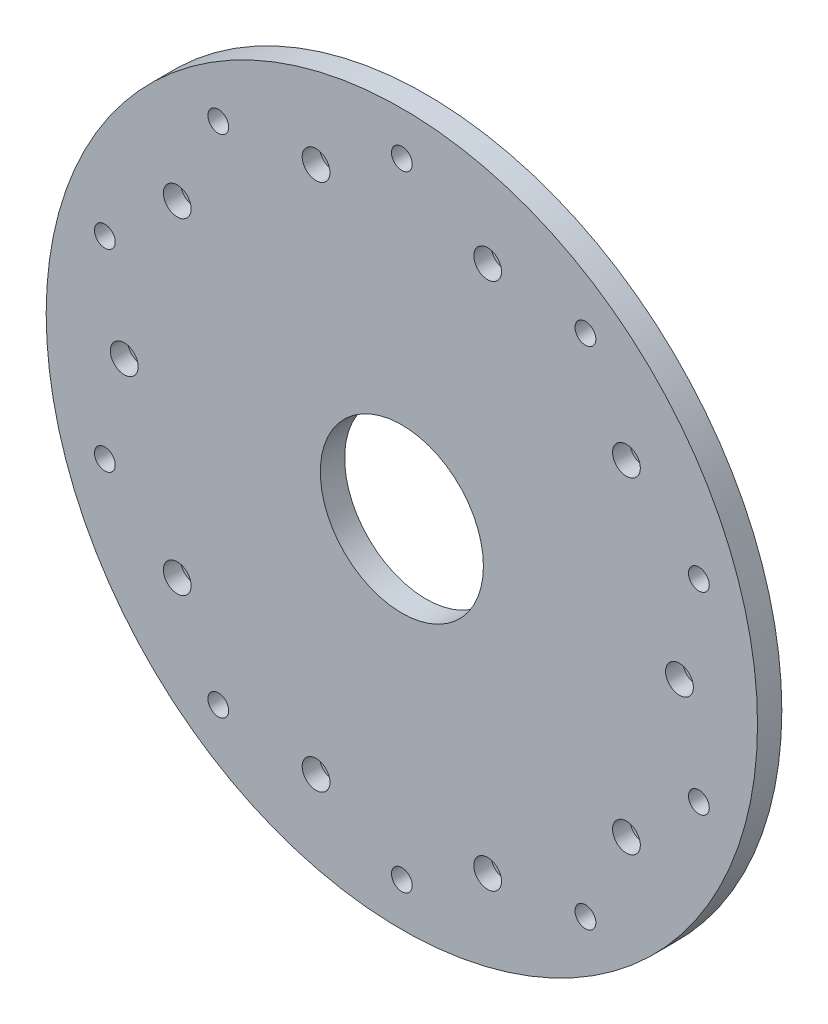
ISO-10303-21;
HEADER;
FILE_DESCRIPTION(('STEP AP214'),'2;1');
FILE_NAME('part.step','',(''),(''),'','','');
FILE_SCHEMA(('AUTOMOTIVE_DESIGN { 1 0 10303 214 1 1 1 1 }'));
ENDSEC;
DATA;
#1=APPLICATION_CONTEXT('core data for automotive mechanical design processes');
#2=APPLICATION_PROTOCOL_DEFINITION('international standard','automotive_design',2000,#1);
#3=PRODUCT_CONTEXT('',#1,'mechanical');
#4=PRODUCT('Part','Part','',(#3));
#5=PRODUCT_RELATED_PRODUCT_CATEGORY('part','',(#4));
#6=PRODUCT_DEFINITION_FORMATION('','',#4);
#7=PRODUCT_DEFINITION_CONTEXT('part definition',#1,'design');
#8=PRODUCT_DEFINITION('design','',#6,#7);
#9=PRODUCT_DEFINITION_SHAPE('','',#8);
#10=(LENGTH_UNIT() NAMED_UNIT(*) SI_UNIT(.MILLI.,.METRE.));
#11=(NAMED_UNIT(*) PLANE_ANGLE_UNIT() SI_UNIT($,.RADIAN.));
#12=(NAMED_UNIT(*) SI_UNIT($,.STERADIAN.) SOLID_ANGLE_UNIT());
#13=UNCERTAINTY_MEASURE_WITH_UNIT(LENGTH_MEASURE(1.E-05),#10,'distance_accuracy_value','');
#14=(GEOMETRIC_REPRESENTATION_CONTEXT(3) GLOBAL_UNCERTAINTY_ASSIGNED_CONTEXT((#13)) GLOBAL_UNIT_ASSIGNED_CONTEXT((#10,
#11,#12)) REPRESENTATION_CONTEXT('',''));
#15=CARTESIAN_POINT('',(0.,0.,0.));
#16=DIRECTION('',(0.,0.,1.));
#17=DIRECTION('',(1.,0.,0.));
#18=AXIS2_PLACEMENT_3D('',#15,#16,#17);
#19=CARTESIAN_POINT('',(0.,0.,7.));
#20=DIRECTION('',(0.,0.,1.));
#21=DIRECTION('',(1.,0.,0.));
#22=AXIS2_PLACEMENT_3D('',#19,#20,#21);
#23=PLANE('',#22);
#24=CARTESIAN_POINT('',(-24.7213595499959,76.0845213036123,7.));
#25=DIRECTION('',(0.,0.,1.));
#26=DIRECTION('',(0.809016994374947,0.587785252292474,0.));
#27=AXIS2_PLACEMENT_3D('',#24,#25,#26);
#28=CIRCLE('',#27,4.);
#29=CARTESIAN_POINT('',(-21.4852915724961,78.4356623127822,7.));
#30=VERTEX_POINT('',#29);
#31=EDGE_CURVE('E164',#30,#30,#28,.T.);
#32=ORIENTED_EDGE('',*,*,#31,.F.);
#33=EDGE_LOOP('',(#32));
#34=FACE_BOUND('',#33,.T.);
#35=CARTESIAN_POINT('',(-64.7213595499959,47.0228201833977,7.));
#36=DIRECTION('',(0.,0.,1.));
#37=DIRECTION('',(0.309016994374945,0.951056516295155,0.));
#38=AXIS2_PLACEMENT_3D('',#35,#36,#37);
#39=CIRCLE('',#38,4.);
#40=CARTESIAN_POINT('',(-63.4852915724961,50.8270462485783,7.));
#41=VERTEX_POINT('',#40);
#42=EDGE_CURVE('E158',#41,#41,#39,.T.);
#43=ORIENTED_EDGE('',*,*,#42,.F.);
#44=EDGE_LOOP('',(#43));
#45=FACE_BOUND('',#44,.T.);
#46=CARTESIAN_POINT('',(-80.,-2.8796409701215E-13,7.));
#47=DIRECTION('',(0.,0.,1.));
#48=DIRECTION('',(-0.309016994374952,0.951056516295152,0.));
#49=AXIS2_PLACEMENT_3D('',#46,#47,#48);
#50=CIRCLE('',#49,4.);
#51=CARTESIAN_POINT('',(-81.2360679774998,3.80422606518032,7.));
#52=VERTEX_POINT('',#51);
#53=EDGE_CURVE('E152',#52,#52,#50,.T.);
#54=ORIENTED_EDGE('',*,*,#53,.F.);
#55=EDGE_LOOP('',(#54));
#56=FACE_BOUND('',#55,.T.);
#57=CARTESIAN_POINT('',(-64.7213595499956,-47.0228201833982,7.));
#58=DIRECTION('',(0.,0.,1.));
#59=DIRECTION('',(-0.809016994374951,0.587785252292469,0.));
#60=AXIS2_PLACEMENT_3D('',#57,#58,#59);
#61=CIRCLE('',#60,4.);
#62=CARTESIAN_POINT('',(-67.9574275274954,-44.6716791742283,7.));
#63=VERTEX_POINT('',#62);
#64=EDGE_CURVE('E146',#63,#63,#61,.T.);
#65=ORIENTED_EDGE('',*,*,#64,.F.);
#66=EDGE_LOOP('',(#65));
#67=FACE_BOUND('',#66,.T.);
#68=CARTESIAN_POINT('',(-24.7213595499959,-76.0845213036123,7.));
#69=DIRECTION('',(0.,0.,1.));
#70=DIRECTION('',(-1.,0.,0.));
#71=AXIS2_PLACEMENT_3D('',#68,#69,#70);
#72=CIRCLE('',#71,4.);
#73=CARTESIAN_POINT('',(-28.7213595499959,-76.0845213036123,7.));
#74=VERTEX_POINT('',#73);
#75=EDGE_CURVE('E140',#74,#74,#72,.T.);
#76=ORIENTED_EDGE('',*,*,#75,.F.);
#77=EDGE_LOOP('',(#76));
#78=FACE_BOUND('',#77,.T.);
#79=CARTESIAN_POINT('',(24.7213595499964,-76.0845213036121,7.));
#80=DIRECTION('',(0.,0.,1.));
#81=DIRECTION('',(-0.809016994374942,-0.58778525229248,0.));
#82=AXIS2_PLACEMENT_3D('',#79,#80,#81);
#83=CIRCLE('',#82,4.);
#84=CARTESIAN_POINT('',(21.4852915724966,-78.435662312782,7.));
#85=VERTEX_POINT('',#84);
#86=EDGE_CURVE('E134',#85,#85,#83,.T.);
#87=ORIENTED_EDGE('',*,*,#86,.F.);
#88=EDGE_LOOP('',(#87));
#89=FACE_BOUND('',#88,.T.);
#90=CARTESIAN_POINT('',(64.7213595499962,-47.0228201833973,7.));
#91=DIRECTION('',(0.,0.,1.));
#92=DIRECTION('',(-0.309016994374938,-0.951056516295157,0.));
#93=AXIS2_PLACEMENT_3D('',#90,#91,#92);
#94=CIRCLE('',#93,4.);
#95=CARTESIAN_POINT('',(63.4852915724965,-50.8270462485779,7.));
#96=VERTEX_POINT('',#95);
#97=EDGE_CURVE('E128',#96,#96,#94,.T.);
#98=ORIENTED_EDGE('',*,*,#97,.F.);
#99=EDGE_LOOP('',(#98));
#100=FACE_BOUND('',#99,.T.);
#101=CARTESIAN_POINT('',(80.,8.50014503228635E-13,7.));
#102=DIRECTION('',(0.,0.,1.));
#103=DIRECTION('',(0.309016994374958,-0.95105651629515,0.));
#104=AXIS2_PLACEMENT_3D('',#101,#102,#103);
#105=CIRCLE('',#104,4.);
#106=CARTESIAN_POINT('',(81.2360679774998,-3.80422606517975,7.));
#107=VERTEX_POINT('',#106);
#108=EDGE_CURVE('E122',#107,#107,#105,.T.);
#109=ORIENTED_EDGE('',*,*,#108,.F.);
#110=EDGE_LOOP('',(#109));
#111=FACE_BOUND('',#110,.T.);
#112=CARTESIAN_POINT('',(64.7213595499952,47.0228201833987,7.));
#113=DIRECTION('',(0.,0.,1.));
#114=DIRECTION('',(0.809016994374955,-0.587785252292462,0.));
#115=AXIS2_PLACEMENT_3D('',#112,#113,#114);
#116=CIRCLE('',#115,4.);
#117=CARTESIAN_POINT('',(67.957427527495,44.6716791742288,7.));
#118=VERTEX_POINT('',#117);
#119=EDGE_CURVE('E116',#118,#118,#116,.T.);
#120=ORIENTED_EDGE('',*,*,#119,.F.);
#121=EDGE_LOOP('',(#120));
#122=FACE_BOUND('',#121,.T.);
#123=CARTESIAN_POINT('',(24.7213595499959,76.0845213036123,7.));
#124=DIRECTION('',(0.,0.,1.));
#125=DIRECTION('',(1.,0.,0.));
#126=AXIS2_PLACEMENT_3D('',#123,#124,#125);
#127=CIRCLE('',#126,4.);
#128=CARTESIAN_POINT('',(28.7213595499959,76.0845213036123,7.));
#129=VERTEX_POINT('',#128);
#130=EDGE_CURVE('E110',#129,#129,#127,.T.);
#131=ORIENTED_EDGE('',*,*,#130,.F.);
#132=EDGE_LOOP('',(#131));
#133=FACE_BOUND('',#132,.T.);
#134=CARTESIAN_POINT('',(0.,90.,7.));
#135=DIRECTION('',(0.,0.,1.));
#136=DIRECTION('',(1.,0.,0.));
#137=AXIS2_PLACEMENT_3D('',#134,#135,#136);
#138=CIRCLE('',#137,3.);
#139=CARTESIAN_POINT('',(3.,90.,7.));
#140=VERTEX_POINT('',#139);
#141=EDGE_CURVE('E99',#140,#140,#138,.T.);
#142=ORIENTED_EDGE('',*,*,#141,.F.);
#143=EDGE_LOOP('',(#142));
#144=FACE_BOUND('',#143,.T.);
#145=CARTESIAN_POINT('',(-52.9006727063221,72.8115294937437,7.));
#146=DIRECTION('',(0.,0.,1.));
#147=DIRECTION('',(1.,0.,0.));
#148=AXIS2_PLACEMENT_3D('',#145,#146,#147);
#149=CIRCLE('',#148,3.00000000000206);
#150=CARTESIAN_POINT('',(-49.9006727063201,72.8115294937437,7.));
#151=VERTEX_POINT('',#150);
#152=EDGE_CURVE('E100',#151,#151,#149,.T.);
#153=ORIENTED_EDGE('',*,*,#152,.F.);
#154=EDGE_LOOP('',(#153));
#155=FACE_BOUND('',#154,.T.);
#156=CARTESIAN_POINT('',(-85.5950864665621,27.8115294937428,7.));
#157=DIRECTION('',(0.,0.,1.));
#158=DIRECTION('',(1.,0.,0.));
#159=AXIS2_PLACEMENT_3D('',#156,#157,#158);
#160=CIRCLE('',#159,3.00000000000338);
#161=CARTESIAN_POINT('',(-82.5950864665587,27.8115294937428,7.));
#162=VERTEX_POINT('',#161);
#163=EDGE_CURVE('E50',#162,#162,#160,.T.);
#164=ORIENTED_EDGE('',*,*,#163,.F.);
#165=EDGE_LOOP('',(#164));
#166=FACE_BOUND('',#165,.T.);
#167=CARTESIAN_POINT('',(-85.5950864665605,-27.8115294937477,7.));
#168=DIRECTION('',(0.,0.,1.));
#169=DIRECTION('',(1.,0.,0.));
#170=AXIS2_PLACEMENT_3D('',#167,#168,#169);
#171=CIRCLE('',#170,3.00000000000472);
#172=CARTESIAN_POINT('',(-82.5950864665558,-27.8115294937477,7.));
#173=VERTEX_POINT('',#172);
#174=EDGE_CURVE('E57',#173,#173,#171,.T.);
#175=ORIENTED_EDGE('',*,*,#174,.F.);
#176=EDGE_LOOP('',(#175));
#177=FACE_BOUND('',#176,.T.);
#178=CARTESIAN_POINT('',(-52.900672706318,-72.8115294937468,7.));
#179=DIRECTION('',(0.,0.,1.));
#180=DIRECTION('',(1.,0.,0.));
#181=AXIS2_PLACEMENT_3D('',#178,#179,#180);
#182=CIRCLE('',#181,3.0000000000056);
#183=CARTESIAN_POINT('',(-49.9006727063124,-72.8115294937468,7.));
#184=VERTEX_POINT('',#183);
#185=EDGE_CURVE('E63',#184,#184,#182,.T.);
#186=ORIENTED_EDGE('',*,*,#185,.F.);
#187=EDGE_LOOP('',(#186));
#188=FACE_BOUND('',#187,.T.);
#189=CARTESIAN_POINT('',(5.09386405508807E-12,-90.,7.));
#190=DIRECTION('',(0.,0.,1.));
#191=DIRECTION('',(1.,0.,0.));
#192=AXIS2_PLACEMENT_3D('',#189,#190,#191);
#193=CIRCLE('',#192,3.00000000000548);
#194=CARTESIAN_POINT('',(3.00000000001057,-90.,7.));
#195=VERTEX_POINT('',#194);
#196=EDGE_CURVE('E69',#195,#195,#193,.T.);
#197=ORIENTED_EDGE('',*,*,#196,.F.);
#198=EDGE_LOOP('',(#197));
#199=FACE_BOUND('',#198,.T.);
#200=CARTESIAN_POINT('',(52.9006727063272,-72.8115294937437,7.));
#201=DIRECTION('',(0.,0.,1.));
#202=DIRECTION('',(1.,0.,0.));
#203=AXIS2_PLACEMENT_3D('',#200,#201,#202);
#204=CIRCLE('',#203,3.00000000000448);
#205=CARTESIAN_POINT('',(55.9006727063317,-72.8115294937437,7.));
#206=VERTEX_POINT('',#205);
#207=EDGE_CURVE('E75',#206,#206,#204,.T.);
#208=ORIENTED_EDGE('',*,*,#207,.F.);
#209=EDGE_LOOP('',(#208));
#210=FACE_BOUND('',#209,.T.);
#211=CARTESIAN_POINT('',(85.5950864665672,-27.8115294937428,7.));
#212=DIRECTION('',(0.,0.,1.));
#213=DIRECTION('',(1.,0.,0.));
#214=AXIS2_PLACEMENT_3D('',#211,#212,#213);
#215=CIRCLE('',#214,3.00000000000286);
#216=CARTESIAN_POINT('',(88.59508646657,-27.8115294937428,7.));
#217=VERTEX_POINT('',#216);
#218=EDGE_CURVE('E81',#217,#217,#215,.T.);
#219=ORIENTED_EDGE('',*,*,#218,.F.);
#220=EDGE_LOOP('',(#219));
#221=FACE_BOUND('',#220,.T.);
#222=CARTESIAN_POINT('',(85.5950864665656,27.8115294937477,7.));
#223=DIRECTION('',(0.,0.,1.));
#224=DIRECTION('',(1.,0.,0.));
#225=AXIS2_PLACEMENT_3D('',#222,#223,#224);
#226=CIRCLE('',#225,3.00000000000123);
#227=CARTESIAN_POINT('',(88.5950864665668,27.8115294937477,7.));
#228=VERTEX_POINT('',#227);
#229=EDGE_CURVE('E87',#228,#228,#226,.T.);
#230=ORIENTED_EDGE('',*,*,#229,.F.);
#231=EDGE_LOOP('',(#230));
#232=FACE_BOUND('',#231,.T.);
#233=CARTESIAN_POINT('',(52.9006727063227,72.8115294937452,7.));
#234=DIRECTION('',(0.,0.,1.));
#235=DIRECTION('',(1.,0.,0.));
#236=AXIS2_PLACEMENT_3D('',#233,#234,#235);
#237=CIRCLE('',#236,3.);
#238=CARTESIAN_POINT('',(55.9006727063227,72.8115294937452,7.));
#239=VERTEX_POINT('',#238);
#240=EDGE_CURVE('E93',#239,#239,#237,.T.);
#241=ORIENTED_EDGE('',*,*,#240,.F.);
#242=EDGE_LOOP('',(#241));
#243=FACE_BOUND('',#242,.T.);
#244=CARTESIAN_POINT('',(0.,0.,7.));
#245=DIRECTION('',(0.,0.,1.));
#246=DIRECTION('',(1.,0.,0.));
#247=AXIS2_PLACEMENT_3D('',#244,#245,#246);
#248=CIRCLE('',#247,102.5);
#249=CARTESIAN_POINT('',(102.5,0.,7.));
#250=VERTEX_POINT('',#249);
#251=EDGE_CURVE('E10',#250,#250,#248,.T.);
#252=ORIENTED_EDGE('',*,*,#251,.T.);
#253=EDGE_LOOP('',(#252));
#254=FACE_BOUND('',#253,.T.);
#255=CARTESIAN_POINT('',(0.,0.,7.));
#256=DIRECTION('',(0.,0.,1.));
#257=DIRECTION('',(1.,0.,0.));
#258=AXIS2_PLACEMENT_3D('',#255,#256,#257);
#259=CIRCLE('',#258,23.5);
#260=CARTESIAN_POINT('',(23.5,0.,7.));
#261=VERTEX_POINT('',#260);
#262=EDGE_CURVE('E42',#261,#261,#259,.T.);
#263=ORIENTED_EDGE('',*,*,#262,.F.);
#264=EDGE_LOOP('',(#263));
#265=FACE_BOUND('',#264,.T.);
#266=ADVANCED_FACE('F31',(#34,#45,#56,#67,#78,#89,#100,#111,#122,#133,#144,#155,#166,#177,#188,
#199,#210,#221,#232,#243,#254,#265),#23,.T.);
#267=CARTESIAN_POINT('',(0.,0.,0.));
#268=DIRECTION('',(0.,0.,1.));
#269=DIRECTION('',(1.,0.,0.));
#270=AXIS2_PLACEMENT_3D('',#267,#268,#269);
#271=PLANE('',#270);
#272=CARTESIAN_POINT('',(0.,90.,0.));
#273=DIRECTION('',(0.,0.,1.));
#274=DIRECTION('',(1.,0.,0.));
#275=AXIS2_PLACEMENT_3D('',#272,#273,#274);
#276=CIRCLE('',#275,3.);
#277=CARTESIAN_POINT('',(3.,90.,0.));
#278=VERTEX_POINT('',#277);
#279=EDGE_CURVE('E47',#278,#278,#276,.T.);
#280=ORIENTED_EDGE('',*,*,#279,.T.);
#281=EDGE_LOOP('',(#280));
#282=FACE_BOUND('',#281,.T.);
#283=CARTESIAN_POINT('',(-52.9006727063221,72.8115294937437,0.));
#284=DIRECTION('',(0.,0.,1.));
#285=DIRECTION('',(1.,0.,0.));
#286=AXIS2_PLACEMENT_3D('',#283,#284,#285);
#287=CIRCLE('',#286,3.00000000000206);
#288=CARTESIAN_POINT('',(-49.9006727063201,72.8115294937437,0.));
#289=VERTEX_POINT('',#288);
#290=EDGE_CURVE('E54',#289,#289,#287,.T.);
#291=ORIENTED_EDGE('',*,*,#290,.T.);
#292=EDGE_LOOP('',(#291));
#293=FACE_BOUND('',#292,.T.);
#294=CARTESIAN_POINT('',(-85.5950864665621,27.8115294937428,0.));
#295=DIRECTION('',(0.,0.,1.));
#296=DIRECTION('',(1.,0.,0.));
#297=AXIS2_PLACEMENT_3D('',#294,#295,#296);
#298=CIRCLE('',#297,3.00000000000338);
#299=CARTESIAN_POINT('',(-82.5950864665587,27.8115294937428,0.));
#300=VERTEX_POINT('',#299);
#301=EDGE_CURVE('E53',#300,#300,#298,.T.);
#302=ORIENTED_EDGE('',*,*,#301,.T.);
#303=EDGE_LOOP('',(#302));
#304=FACE_BOUND('',#303,.T.);
#305=CARTESIAN_POINT('',(-85.5950864665605,-27.8115294937477,0.));
#306=DIRECTION('',(0.,0.,1.));
#307=DIRECTION('',(1.,0.,0.));
#308=AXIS2_PLACEMENT_3D('',#305,#306,#307);
#309=CIRCLE('',#308,3.00000000000472);
#310=CARTESIAN_POINT('',(-82.5950864665558,-27.8115294937477,0.));
#311=VERTEX_POINT('',#310);
#312=EDGE_CURVE('E60',#311,#311,#309,.T.);
#313=ORIENTED_EDGE('',*,*,#312,.T.);
#314=EDGE_LOOP('',(#313));
#315=FACE_BOUND('',#314,.T.);
#316=CARTESIAN_POINT('',(-52.900672706318,-72.8115294937468,0.));
#317=DIRECTION('',(0.,0.,1.));
#318=DIRECTION('',(1.,0.,0.));
#319=AXIS2_PLACEMENT_3D('',#316,#317,#318);
#320=CIRCLE('',#319,3.0000000000056);
#321=CARTESIAN_POINT('',(-49.9006727063124,-72.8115294937468,0.));
#322=VERTEX_POINT('',#321);
#323=EDGE_CURVE('E66',#322,#322,#320,.T.);
#324=ORIENTED_EDGE('',*,*,#323,.T.);
#325=EDGE_LOOP('',(#324));
#326=FACE_BOUND('',#325,.T.);
#327=CARTESIAN_POINT('',(5.09386405508807E-12,-90.,0.));
#328=DIRECTION('',(0.,0.,1.));
#329=DIRECTION('',(1.,0.,0.));
#330=AXIS2_PLACEMENT_3D('',#327,#328,#329);
#331=CIRCLE('',#330,3.00000000000548);
#332=CARTESIAN_POINT('',(3.00000000001057,-90.,0.));
#333=VERTEX_POINT('',#332);
#334=EDGE_CURVE('E72',#333,#333,#331,.T.);
#335=ORIENTED_EDGE('',*,*,#334,.T.);
#336=EDGE_LOOP('',(#335));
#337=FACE_BOUND('',#336,.T.);
#338=CARTESIAN_POINT('',(52.9006727063272,-72.8115294937437,0.));
#339=DIRECTION('',(0.,0.,1.));
#340=DIRECTION('',(1.,0.,0.));
#341=AXIS2_PLACEMENT_3D('',#338,#339,#340);
#342=CIRCLE('',#341,3.00000000000448);
#343=CARTESIAN_POINT('',(55.9006727063317,-72.8115294937437,0.));
#344=VERTEX_POINT('',#343);
#345=EDGE_CURVE('E78',#344,#344,#342,.T.);
#346=ORIENTED_EDGE('',*,*,#345,.T.);
#347=EDGE_LOOP('',(#346));
#348=FACE_BOUND('',#347,.T.);
#349=CARTESIAN_POINT('',(85.5950864665672,-27.8115294937428,0.));
#350=DIRECTION('',(0.,0.,1.));
#351=DIRECTION('',(1.,0.,0.));
#352=AXIS2_PLACEMENT_3D('',#349,#350,#351);
#353=CIRCLE('',#352,3.00000000000286);
#354=CARTESIAN_POINT('',(88.59508646657,-27.8115294937428,0.));
#355=VERTEX_POINT('',#354);
#356=EDGE_CURVE('E84',#355,#355,#353,.T.);
#357=ORIENTED_EDGE('',*,*,#356,.T.);
#358=EDGE_LOOP('',(#357));
#359=FACE_BOUND('',#358,.T.);
#360=CARTESIAN_POINT('',(85.5950864665656,27.8115294937477,0.));
#361=DIRECTION('',(0.,0.,1.));
#362=DIRECTION('',(1.,0.,0.));
#363=AXIS2_PLACEMENT_3D('',#360,#361,#362);
#364=CIRCLE('',#363,3.00000000000123);
#365=CARTESIAN_POINT('',(88.5950864665668,27.8115294937477,0.));
#366=VERTEX_POINT('',#365);
#367=EDGE_CURVE('E90',#366,#366,#364,.T.);
#368=ORIENTED_EDGE('',*,*,#367,.T.);
#369=EDGE_LOOP('',(#368));
#370=FACE_BOUND('',#369,.T.);
#371=CARTESIAN_POINT('',(52.9006727063227,72.8115294937452,0.));
#372=DIRECTION('',(0.,0.,1.));
#373=DIRECTION('',(1.,0.,0.));
#374=AXIS2_PLACEMENT_3D('',#371,#372,#373);
#375=CIRCLE('',#374,3.);
#376=CARTESIAN_POINT('',(55.9006727063227,72.8115294937452,0.));
#377=VERTEX_POINT('',#376);
#378=EDGE_CURVE('E96',#377,#377,#375,.T.);
#379=ORIENTED_EDGE('',*,*,#378,.T.);
#380=EDGE_LOOP('',(#379));
#381=FACE_BOUND('',#380,.T.);
#382=CARTESIAN_POINT('',(0.,0.,0.));
#383=DIRECTION('',(0.,0.,1.));
#384=DIRECTION('',(1.,0.,0.));
#385=AXIS2_PLACEMENT_3D('',#382,#383,#384);
#386=CIRCLE('',#385,102.5);
#387=CARTESIAN_POINT('',(102.5,0.,0.));
#388=VERTEX_POINT('',#387);
#389=EDGE_CURVE('E35',#388,#388,#386,.T.);
#390=ORIENTED_EDGE('',*,*,#389,.F.);
#391=EDGE_LOOP('',(#390));
#392=FACE_BOUND('',#391,.T.);
#393=CARTESIAN_POINT('',(0.,0.,0.));
#394=DIRECTION('',(0.,0.,1.));
#395=DIRECTION('',(1.,0.,0.));
#396=AXIS2_PLACEMENT_3D('',#393,#394,#395);
#397=CIRCLE('',#396,23.5);
#398=CARTESIAN_POINT('',(23.5,0.,0.));
#399=VERTEX_POINT('',#398);
#400=EDGE_CURVE('E44',#399,#399,#397,.T.);
#401=ORIENTED_EDGE('',*,*,#400,.T.);
#402=EDGE_LOOP('',(#401));
#403=FACE_BOUND('',#402,.T.);
#404=ADVANCED_FACE('F181',(#282,#293,#304,#315,#326,#337,#348,#359,#370,#381,#392,#403),#271,.F.);
#405=CARTESIAN_POINT('',(0.,0.,7.));
#406=DIRECTION('',(0.,0.,-1.));
#407=DIRECTION('',(-1.,0.,0.));
#408=AXIS2_PLACEMENT_3D('',#405,#406,#407);
#409=CYLINDRICAL_SURFACE('',#408,102.5);
#410=ORIENTED_EDGE('',*,*,#251,.F.);
#411=EDGE_LOOP('',(#410));
#412=FACE_BOUND('',#411,.T.);
#413=ORIENTED_EDGE('',*,*,#389,.T.);
#414=EDGE_LOOP('',(#413));
#415=FACE_BOUND('',#414,.T.);
#416=ADVANCED_FACE('F33',(#412,#415),#409,.T.);
#417=CARTESIAN_POINT('',(0.,0.,7.));
#418=DIRECTION('',(0.,0.,-1.));
#419=DIRECTION('',(-1.,0.,0.));
#420=AXIS2_PLACEMENT_3D('',#417,#418,#419);
#421=CYLINDRICAL_SURFACE('',#420,23.5);
#422=ORIENTED_EDGE('',*,*,#262,.T.);
#423=EDGE_LOOP('',(#422));
#424=FACE_BOUND('',#423,.T.);
#425=ORIENTED_EDGE('',*,*,#400,.F.);
#426=EDGE_LOOP('',(#425));
#427=FACE_BOUND('',#426,.T.);
#428=ADVANCED_FACE('F223',(#424,#427),#421,.F.);
#429=CARTESIAN_POINT('',(52.9006727063227,72.8115294937452,0.));
#430=DIRECTION('',(0.,0.,1.));
#431=DIRECTION('',(1.,0.,0.));
#432=AXIS2_PLACEMENT_3D('',#429,#430,#431);
#433=CYLINDRICAL_SURFACE('',#432,3.);
#434=ORIENTED_EDGE('',*,*,#378,.F.);
#435=EDGE_LOOP('',(#434));
#436=FACE_BOUND('',#435,.T.);
#437=ORIENTED_EDGE('',*,*,#240,.T.);
#438=EDGE_LOOP('',(#437));
#439=FACE_BOUND('',#438,.T.);
#440=ADVANCED_FACE('F226',(#436,#439),#433,.F.);
#441=CARTESIAN_POINT('',(85.5950864665656,27.8115294937477,0.));
#442=DIRECTION('',(0.,0.,1.));
#443=DIRECTION('',(1.,0.,0.));
#444=AXIS2_PLACEMENT_3D('',#441,#442,#443);
#445=CYLINDRICAL_SURFACE('',#444,3.00000000000123);
#446=ORIENTED_EDGE('',*,*,#367,.F.);
#447=EDGE_LOOP('',(#446));
#448=FACE_BOUND('',#447,.T.);
#449=ORIENTED_EDGE('',*,*,#229,.T.);
#450=EDGE_LOOP('',(#449));
#451=FACE_BOUND('',#450,.T.);
#452=ADVANCED_FACE('F263',(#448,#451),#445,.F.);
#453=CARTESIAN_POINT('',(85.5950864665672,-27.8115294937428,0.));
#454=DIRECTION('',(0.,0.,1.));
#455=DIRECTION('',(1.,0.,0.));
#456=AXIS2_PLACEMENT_3D('',#453,#454,#455);
#457=CYLINDRICAL_SURFACE('',#456,3.00000000000286);
#458=ORIENTED_EDGE('',*,*,#356,.F.);
#459=EDGE_LOOP('',(#458));
#460=FACE_BOUND('',#459,.T.);
#461=ORIENTED_EDGE('',*,*,#218,.T.);
#462=EDGE_LOOP('',(#461));
#463=FACE_BOUND('',#462,.T.);
#464=ADVANCED_FACE('F259',(#460,#463),#457,.F.);
#465=CARTESIAN_POINT('',(52.9006727063272,-72.8115294937437,0.));
#466=DIRECTION('',(0.,0.,1.));
#467=DIRECTION('',(1.,0.,0.));
#468=AXIS2_PLACEMENT_3D('',#465,#466,#467);
#469=CYLINDRICAL_SURFACE('',#468,3.00000000000448);
#470=ORIENTED_EDGE('',*,*,#345,.F.);
#471=EDGE_LOOP('',(#470));
#472=FACE_BOUND('',#471,.T.);
#473=ORIENTED_EDGE('',*,*,#207,.T.);
#474=EDGE_LOOP('',(#473));
#475=FACE_BOUND('',#474,.T.);
#476=ADVANCED_FACE('F255',(#472,#475),#469,.F.);
#477=CARTESIAN_POINT('',(5.09386405508807E-12,-90.,0.));
#478=DIRECTION('',(0.,0.,1.));
#479=DIRECTION('',(1.,0.,0.));
#480=AXIS2_PLACEMENT_3D('',#477,#478,#479);
#481=CYLINDRICAL_SURFACE('',#480,3.00000000000548);
#482=ORIENTED_EDGE('',*,*,#334,.F.);
#483=EDGE_LOOP('',(#482));
#484=FACE_BOUND('',#483,.T.);
#485=ORIENTED_EDGE('',*,*,#196,.T.);
#486=EDGE_LOOP('',(#485));
#487=FACE_BOUND('',#486,.T.);
#488=ADVANCED_FACE('F251',(#484,#487),#481,.F.);
#489=CARTESIAN_POINT('',(-52.900672706318,-72.8115294937468,0.));
#490=DIRECTION('',(0.,0.,1.));
#491=DIRECTION('',(1.,0.,0.));
#492=AXIS2_PLACEMENT_3D('',#489,#490,#491);
#493=CYLINDRICAL_SURFACE('',#492,3.0000000000056);
#494=ORIENTED_EDGE('',*,*,#323,.F.);
#495=EDGE_LOOP('',(#494));
#496=FACE_BOUND('',#495,.T.);
#497=ORIENTED_EDGE('',*,*,#185,.T.);
#498=EDGE_LOOP('',(#497));
#499=FACE_BOUND('',#498,.T.);
#500=ADVANCED_FACE('F247',(#496,#499),#493,.F.);
#501=CARTESIAN_POINT('',(-85.5950864665605,-27.8115294937477,0.));
#502=DIRECTION('',(0.,0.,1.));
#503=DIRECTION('',(1.,0.,0.));
#504=AXIS2_PLACEMENT_3D('',#501,#502,#503);
#505=CYLINDRICAL_SURFACE('',#504,3.00000000000472);
#506=ORIENTED_EDGE('',*,*,#312,.F.);
#507=EDGE_LOOP('',(#506));
#508=FACE_BOUND('',#507,.T.);
#509=ORIENTED_EDGE('',*,*,#174,.T.);
#510=EDGE_LOOP('',(#509));
#511=FACE_BOUND('',#510,.T.);
#512=ADVANCED_FACE('F243',(#508,#511),#505,.F.);
#513=CARTESIAN_POINT('',(-85.5950864665621,27.8115294937428,0.));
#514=DIRECTION('',(0.,0.,1.));
#515=DIRECTION('',(1.,0.,0.));
#516=AXIS2_PLACEMENT_3D('',#513,#514,#515);
#517=CYLINDRICAL_SURFACE('',#516,3.00000000000338);
#518=ORIENTED_EDGE('',*,*,#301,.F.);
#519=EDGE_LOOP('',(#518));
#520=FACE_BOUND('',#519,.T.);
#521=ORIENTED_EDGE('',*,*,#163,.T.);
#522=EDGE_LOOP('',(#521));
#523=FACE_BOUND('',#522,.T.);
#524=ADVANCED_FACE('F239',(#520,#523),#517,.F.);
#525=CARTESIAN_POINT('',(-52.9006727063221,72.8115294937437,0.));
#526=DIRECTION('',(0.,0.,1.));
#527=DIRECTION('',(1.,0.,0.));
#528=AXIS2_PLACEMENT_3D('',#525,#526,#527);
#529=CYLINDRICAL_SURFACE('',#528,3.00000000000206);
#530=ORIENTED_EDGE('',*,*,#290,.F.);
#531=EDGE_LOOP('',(#530));
#532=FACE_BOUND('',#531,.T.);
#533=ORIENTED_EDGE('',*,*,#152,.T.);
#534=EDGE_LOOP('',(#533));
#535=FACE_BOUND('',#534,.T.);
#536=ADVANCED_FACE('F242',(#532,#535),#529,.F.);
#537=CARTESIAN_POINT('',(0.,90.,0.));
#538=DIRECTION('',(0.,0.,1.));
#539=DIRECTION('',(1.,0.,0.));
#540=AXIS2_PLACEMENT_3D('',#537,#538,#539);
#541=CYLINDRICAL_SURFACE('',#540,3.);
#542=ORIENTED_EDGE('',*,*,#279,.F.);
#543=EDGE_LOOP('',(#542));
#544=FACE_BOUND('',#543,.T.);
#545=ORIENTED_EDGE('',*,*,#141,.T.);
#546=EDGE_LOOP('',(#545));
#547=FACE_BOUND('',#546,.T.);
#548=ADVANCED_FACE('F273',(#544,#547),#541,.F.);
#549=CARTESIAN_POINT('',(24.7213595499959,76.0845213036123,2.));
#550=DIRECTION('',(0.,0.,1.));
#551=DIRECTION('',(1.,0.,0.));
#552=AXIS2_PLACEMENT_3D('',#549,#550,#551);
#553=CYLINDRICAL_SURFACE('',#552,4.);
#554=CARTESIAN_POINT('',(24.7213595499959,76.0845213036123,2.));
#555=DIRECTION('',(0.,0.,1.));
#556=DIRECTION('',(1.,0.,0.));
#557=AXIS2_PLACEMENT_3D('',#554,#555,#556);
#558=CIRCLE('',#557,4.);
#559=CARTESIAN_POINT('',(28.7213595499959,76.0845213036123,2.));
#560=VERTEX_POINT('',#559);
#561=EDGE_CURVE('E103',#560,#560,#558,.T.);
#562=ORIENTED_EDGE('',*,*,#561,.F.);
#563=EDGE_LOOP('',(#562));
#564=FACE_BOUND('',#563,.T.);
#565=ORIENTED_EDGE('',*,*,#130,.T.);
#566=EDGE_LOOP('',(#565));
#567=FACE_BOUND('',#566,.T.);
#568=ADVANCED_FACE('F277',(#564,#567),#553,.F.);
#569=CARTESIAN_POINT('',(24.7213595499959,76.0845213036123,2.));
#570=DIRECTION('',(0.,0.,1.));
#571=DIRECTION('',(1.,0.,0.));
#572=AXIS2_PLACEMENT_3D('',#569,#570,#571);
#573=PLANE('',#572);
#574=ORIENTED_EDGE('',*,*,#561,.T.);
#575=EDGE_LOOP('',(#574));
#576=FACE_BOUND('',#575,.T.);
#577=ADVANCED_FACE('F281',(#576),#573,.T.);
#578=CARTESIAN_POINT('',(64.7213595499952,47.0228201833987,2.));
#579=DIRECTION('',(0.,0.,1.));
#580=DIRECTION('',(1.,0.,0.));
#581=AXIS2_PLACEMENT_3D('',#578,#579,#580);
#582=CYLINDRICAL_SURFACE('',#581,4.);
#583=CARTESIAN_POINT('',(64.7213595499952,47.0228201833987,2.));
#584=DIRECTION('',(0.,0.,1.));
#585=DIRECTION('',(0.809016994374955,-0.587785252292462,0.));
#586=AXIS2_PLACEMENT_3D('',#583,#584,#585);
#587=CIRCLE('',#586,4.);
#588=CARTESIAN_POINT('',(67.957427527495,44.6716791742288,2.));
#589=VERTEX_POINT('',#588);
#590=EDGE_CURVE('E119',#589,#589,#587,.T.);
#591=ORIENTED_EDGE('',*,*,#590,.F.);
#592=EDGE_LOOP('',(#591));
#593=FACE_BOUND('',#592,.T.);
#594=ORIENTED_EDGE('',*,*,#119,.T.);
#595=EDGE_LOOP('',(#594));
#596=FACE_BOUND('',#595,.T.);
#597=ADVANCED_FACE('F285',(#593,#596),#582,.F.);
#598=CARTESIAN_POINT('',(64.7213595499952,47.0228201833987,2.));
#599=DIRECTION('',(0.,0.,1.));
#600=DIRECTION('',(0.809016994374955,-0.587785252292462,0.));
#601=AXIS2_PLACEMENT_3D('',#598,#599,#600);
#602=PLANE('',#601);
#603=ORIENTED_EDGE('',*,*,#590,.T.);
#604=EDGE_LOOP('',(#603));
#605=FACE_BOUND('',#604,.T.);
#606=ADVANCED_FACE('F289',(#605),#602,.T.);
#607=CARTESIAN_POINT('',(80.,8.50014503228635E-13,2.));
#608=DIRECTION('',(0.,0.,1.));
#609=DIRECTION('',(1.,0.,0.));
#610=AXIS2_PLACEMENT_3D('',#607,#608,#609);
#611=CYLINDRICAL_SURFACE('',#610,4.);
#612=CARTESIAN_POINT('',(80.,8.50014503228635E-13,2.));
#613=DIRECTION('',(0.,0.,1.));
#614=DIRECTION('',(0.309016994374958,-0.95105651629515,0.));
#615=AXIS2_PLACEMENT_3D('',#612,#613,#614);
#616=CIRCLE('',#615,4.);
#617=CARTESIAN_POINT('',(81.2360679774998,-3.80422606517975,2.));
#618=VERTEX_POINT('',#617);
#619=EDGE_CURVE('E125',#618,#618,#616,.T.);
#620=ORIENTED_EDGE('',*,*,#619,.F.);
#621=EDGE_LOOP('',(#620));
#622=FACE_BOUND('',#621,.T.);
#623=ORIENTED_EDGE('',*,*,#108,.T.);
#624=EDGE_LOOP('',(#623));
#625=FACE_BOUND('',#624,.T.);
#626=ADVANCED_FACE('F293',(#622,#625),#611,.F.);
#627=CARTESIAN_POINT('',(80.,8.50014503228635E-13,2.));
#628=DIRECTION('',(0.,0.,1.));
#629=DIRECTION('',(0.309016994374958,-0.95105651629515,0.));
#630=AXIS2_PLACEMENT_3D('',#627,#628,#629);
#631=PLANE('',#630);
#632=ORIENTED_EDGE('',*,*,#619,.T.);
#633=EDGE_LOOP('',(#632));
#634=FACE_BOUND('',#633,.T.);
#635=ADVANCED_FACE('F297',(#634),#631,.T.);
#636=CARTESIAN_POINT('',(64.7213595499962,-47.0228201833973,2.));
#637=DIRECTION('',(0.,0.,1.));
#638=DIRECTION('',(1.,0.,0.));
#639=AXIS2_PLACEMENT_3D('',#636,#637,#638);
#640=CYLINDRICAL_SURFACE('',#639,4.);
#641=CARTESIAN_POINT('',(64.7213595499962,-47.0228201833973,2.));
#642=DIRECTION('',(0.,0.,1.));
#643=DIRECTION('',(-0.309016994374938,-0.951056516295157,0.));
#644=AXIS2_PLACEMENT_3D('',#641,#642,#643);
#645=CIRCLE('',#644,4.);
#646=CARTESIAN_POINT('',(63.4852915724965,-50.8270462485779,2.));
#647=VERTEX_POINT('',#646);
#648=EDGE_CURVE('E131',#647,#647,#645,.T.);
#649=ORIENTED_EDGE('',*,*,#648,.F.);
#650=EDGE_LOOP('',(#649));
#651=FACE_BOUND('',#650,.T.);
#652=ORIENTED_EDGE('',*,*,#97,.T.);
#653=EDGE_LOOP('',(#652));
#654=FACE_BOUND('',#653,.T.);
#655=ADVANCED_FACE('F301',(#651,#654),#640,.F.);
#656=CARTESIAN_POINT('',(64.7213595499962,-47.0228201833973,2.));
#657=DIRECTION('',(0.,0.,1.));
#658=DIRECTION('',(-0.309016994374938,-0.951056516295157,0.));
#659=AXIS2_PLACEMENT_3D('',#656,#657,#658);
#660=PLANE('',#659);
#661=ORIENTED_EDGE('',*,*,#648,.T.);
#662=EDGE_LOOP('',(#661));
#663=FACE_BOUND('',#662,.T.);
#664=ADVANCED_FACE('F305',(#663),#660,.T.);
#665=CARTESIAN_POINT('',(24.7213595499964,-76.0845213036121,2.));
#666=DIRECTION('',(0.,0.,1.));
#667=DIRECTION('',(1.,0.,0.));
#668=AXIS2_PLACEMENT_3D('',#665,#666,#667);
#669=CYLINDRICAL_SURFACE('',#668,4.);
#670=CARTESIAN_POINT('',(24.7213595499964,-76.0845213036121,2.));
#671=DIRECTION('',(0.,0.,1.));
#672=DIRECTION('',(-0.809016994374942,-0.58778525229248,0.));
#673=AXIS2_PLACEMENT_3D('',#670,#671,#672);
#674=CIRCLE('',#673,4.);
#675=CARTESIAN_POINT('',(21.4852915724966,-78.435662312782,2.));
#676=VERTEX_POINT('',#675);
#677=EDGE_CURVE('E137',#676,#676,#674,.T.);
#678=ORIENTED_EDGE('',*,*,#677,.F.);
#679=EDGE_LOOP('',(#678));
#680=FACE_BOUND('',#679,.T.);
#681=ORIENTED_EDGE('',*,*,#86,.T.);
#682=EDGE_LOOP('',(#681));
#683=FACE_BOUND('',#682,.T.);
#684=ADVANCED_FACE('F309',(#680,#683),#669,.F.);
#685=CARTESIAN_POINT('',(24.7213595499964,-76.0845213036121,2.));
#686=DIRECTION('',(0.,0.,1.));
#687=DIRECTION('',(-0.809016994374942,-0.58778525229248,0.));
#688=AXIS2_PLACEMENT_3D('',#685,#686,#687);
#689=PLANE('',#688);
#690=ORIENTED_EDGE('',*,*,#677,.T.);
#691=EDGE_LOOP('',(#690));
#692=FACE_BOUND('',#691,.T.);
#693=ADVANCED_FACE('F313',(#692),#689,.T.);
#694=CARTESIAN_POINT('',(-24.7213595499959,-76.0845213036123,2.));
#695=DIRECTION('',(0.,0.,1.));
#696=DIRECTION('',(1.,0.,0.));
#697=AXIS2_PLACEMENT_3D('',#694,#695,#696);
#698=CYLINDRICAL_SURFACE('',#697,4.);
#699=CARTESIAN_POINT('',(-24.7213595499959,-76.0845213036123,2.));
#700=DIRECTION('',(0.,0.,1.));
#701=DIRECTION('',(-1.,0.,0.));
#702=AXIS2_PLACEMENT_3D('',#699,#700,#701);
#703=CIRCLE('',#702,4.);
#704=CARTESIAN_POINT('',(-28.7213595499959,-76.0845213036123,2.));
#705=VERTEX_POINT('',#704);
#706=EDGE_CURVE('E143',#705,#705,#703,.T.);
#707=ORIENTED_EDGE('',*,*,#706,.F.);
#708=EDGE_LOOP('',(#707));
#709=FACE_BOUND('',#708,.T.);
#710=ORIENTED_EDGE('',*,*,#75,.T.);
#711=EDGE_LOOP('',(#710));
#712=FACE_BOUND('',#711,.T.);
#713=ADVANCED_FACE('F317',(#709,#712),#698,.F.);
#714=CARTESIAN_POINT('',(-24.7213595499959,-76.0845213036123,2.));
#715=DIRECTION('',(0.,0.,1.));
#716=DIRECTION('',(-1.,0.,0.));
#717=AXIS2_PLACEMENT_3D('',#714,#715,#716);
#718=PLANE('',#717);
#719=ORIENTED_EDGE('',*,*,#706,.T.);
#720=EDGE_LOOP('',(#719));
#721=FACE_BOUND('',#720,.T.);
#722=ADVANCED_FACE('F321',(#721),#718,.T.);
#723=CARTESIAN_POINT('',(-64.7213595499956,-47.0228201833982,2.));
#724=DIRECTION('',(0.,0.,1.));
#725=DIRECTION('',(1.,0.,0.));
#726=AXIS2_PLACEMENT_3D('',#723,#724,#725);
#727=CYLINDRICAL_SURFACE('',#726,4.);
#728=CARTESIAN_POINT('',(-64.7213595499956,-47.0228201833982,2.));
#729=DIRECTION('',(0.,0.,1.));
#730=DIRECTION('',(-0.809016994374951,0.587785252292469,0.));
#731=AXIS2_PLACEMENT_3D('',#728,#729,#730);
#732=CIRCLE('',#731,4.);
#733=CARTESIAN_POINT('',(-67.9574275274954,-44.6716791742283,2.));
#734=VERTEX_POINT('',#733);
#735=EDGE_CURVE('E149',#734,#734,#732,.T.);
#736=ORIENTED_EDGE('',*,*,#735,.F.);
#737=EDGE_LOOP('',(#736));
#738=FACE_BOUND('',#737,.T.);
#739=ORIENTED_EDGE('',*,*,#64,.T.);
#740=EDGE_LOOP('',(#739));
#741=FACE_BOUND('',#740,.T.);
#742=ADVANCED_FACE('F325',(#738,#741),#727,.F.);
#743=CARTESIAN_POINT('',(-64.7213595499956,-47.0228201833982,2.));
#744=DIRECTION('',(0.,0.,1.));
#745=DIRECTION('',(-0.809016994374951,0.587785252292469,0.));
#746=AXIS2_PLACEMENT_3D('',#743,#744,#745);
#747=PLANE('',#746);
#748=ORIENTED_EDGE('',*,*,#735,.T.);
#749=EDGE_LOOP('',(#748));
#750=FACE_BOUND('',#749,.T.);
#751=ADVANCED_FACE('F329',(#750),#747,.T.);
#752=CARTESIAN_POINT('',(-80.,-2.8796409701215E-13,2.));
#753=DIRECTION('',(0.,0.,1.));
#754=DIRECTION('',(1.,0.,0.));
#755=AXIS2_PLACEMENT_3D('',#752,#753,#754);
#756=CYLINDRICAL_SURFACE('',#755,4.);
#757=CARTESIAN_POINT('',(-80.,-2.8796409701215E-13,2.));
#758=DIRECTION('',(0.,0.,1.));
#759=DIRECTION('',(-0.309016994374952,0.951056516295152,0.));
#760=AXIS2_PLACEMENT_3D('',#757,#758,#759);
#761=CIRCLE('',#760,4.);
#762=CARTESIAN_POINT('',(-81.2360679774998,3.80422606518032,2.));
#763=VERTEX_POINT('',#762);
#764=EDGE_CURVE('E155',#763,#763,#761,.T.);
#765=ORIENTED_EDGE('',*,*,#764,.F.);
#766=EDGE_LOOP('',(#765));
#767=FACE_BOUND('',#766,.T.);
#768=ORIENTED_EDGE('',*,*,#53,.T.);
#769=EDGE_LOOP('',(#768));
#770=FACE_BOUND('',#769,.T.);
#771=ADVANCED_FACE('F333',(#767,#770),#756,.F.);
#772=CARTESIAN_POINT('',(-80.,-2.8796409701215E-13,2.));
#773=DIRECTION('',(0.,0.,1.));
#774=DIRECTION('',(-0.309016994374952,0.951056516295152,0.));
#775=AXIS2_PLACEMENT_3D('',#772,#773,#774);
#776=PLANE('',#775);
#777=ORIENTED_EDGE('',*,*,#764,.T.);
#778=EDGE_LOOP('',(#777));
#779=FACE_BOUND('',#778,.T.);
#780=ADVANCED_FACE('F337',(#779),#776,.T.);
#781=CARTESIAN_POINT('',(-64.7213595499959,47.0228201833977,2.));
#782=DIRECTION('',(0.,0.,1.));
#783=DIRECTION('',(1.,0.,0.));
#784=AXIS2_PLACEMENT_3D('',#781,#782,#783);
#785=CYLINDRICAL_SURFACE('',#784,4.);
#786=CARTESIAN_POINT('',(-64.7213595499959,47.0228201833977,2.));
#787=DIRECTION('',(0.,0.,1.));
#788=DIRECTION('',(0.309016994374945,0.951056516295155,0.));
#789=AXIS2_PLACEMENT_3D('',#786,#787,#788);
#790=CIRCLE('',#789,4.);
#791=CARTESIAN_POINT('',(-63.4852915724961,50.8270462485783,2.));
#792=VERTEX_POINT('',#791);
#793=EDGE_CURVE('E161',#792,#792,#790,.T.);
#794=ORIENTED_EDGE('',*,*,#793,.F.);
#795=EDGE_LOOP('',(#794));
#796=FACE_BOUND('',#795,.T.);
#797=ORIENTED_EDGE('',*,*,#42,.T.);
#798=EDGE_LOOP('',(#797));
#799=FACE_BOUND('',#798,.T.);
#800=ADVANCED_FACE('F341',(#796,#799),#785,.F.);
#801=CARTESIAN_POINT('',(-64.7213595499959,47.0228201833977,2.));
#802=DIRECTION('',(0.,0.,1.));
#803=DIRECTION('',(0.309016994374945,0.951056516295155,0.));
#804=AXIS2_PLACEMENT_3D('',#801,#802,#803);
#805=PLANE('',#804);
#806=ORIENTED_EDGE('',*,*,#793,.T.);
#807=EDGE_LOOP('',(#806));
#808=FACE_BOUND('',#807,.T.);
#809=ADVANCED_FACE('F175',(#808),#805,.T.);
#810=CARTESIAN_POINT('',(-24.7213595499959,76.0845213036123,2.));
#811=DIRECTION('',(0.,0.,1.));
#812=DIRECTION('',(1.,0.,0.));
#813=AXIS2_PLACEMENT_3D('',#810,#811,#812);
#814=CYLINDRICAL_SURFACE('',#813,4.);
#815=CARTESIAN_POINT('',(-24.7213595499959,76.0845213036123,2.));
#816=DIRECTION('',(0.,0.,1.));
#817=DIRECTION('',(0.809016994374947,0.587785252292474,0.));
#818=AXIS2_PLACEMENT_3D('',#815,#816,#817);
#819=CIRCLE('',#818,4.);
#820=CARTESIAN_POINT('',(-21.4852915724961,78.4356623127822,2.));
#821=VERTEX_POINT('',#820);
#822=EDGE_CURVE('E113',#821,#821,#819,.T.);
#823=ORIENTED_EDGE('',*,*,#822,.F.);
#824=EDGE_LOOP('',(#823));
#825=FACE_BOUND('',#824,.T.);
#826=ORIENTED_EDGE('',*,*,#31,.T.);
#827=EDGE_LOOP('',(#826));
#828=FACE_BOUND('',#827,.T.);
#829=ADVANCED_FACE('F172',(#825,#828),#814,.F.);
#830=CARTESIAN_POINT('',(-24.7213595499959,76.0845213036123,2.));
#831=DIRECTION('',(0.,0.,1.));
#832=DIRECTION('',(0.809016994374947,0.587785252292474,0.));
#833=AXIS2_PLACEMENT_3D('',#830,#831,#832);
#834=PLANE('',#833);
#835=ORIENTED_EDGE('',*,*,#822,.T.);
#836=EDGE_LOOP('',(#835));
#837=FACE_BOUND('',#836,.T.);
#838=ADVANCED_FACE('F170',(#837),#834,.T.);
#839=CLOSED_SHELL('',(#266,#404,#416,#428,#440,#452,#464,#476,#488,#500,#512,#524,#536,#548,
#568,#577,#597,#606,#626,#635,#655,#664,#684,#693,#713,#722,#742,#751,#771,#780,#800,#809,#829,#838));
#840=MANIFOLD_SOLID_BREP('B2',#839);
#841=ADVANCED_BREP_SHAPE_REPRESENTATION('',(#18,#840),#14);
#842=SHAPE_DEFINITION_REPRESENTATION(#9,#841);
ENDSEC;
END-ISO-10303-21;
